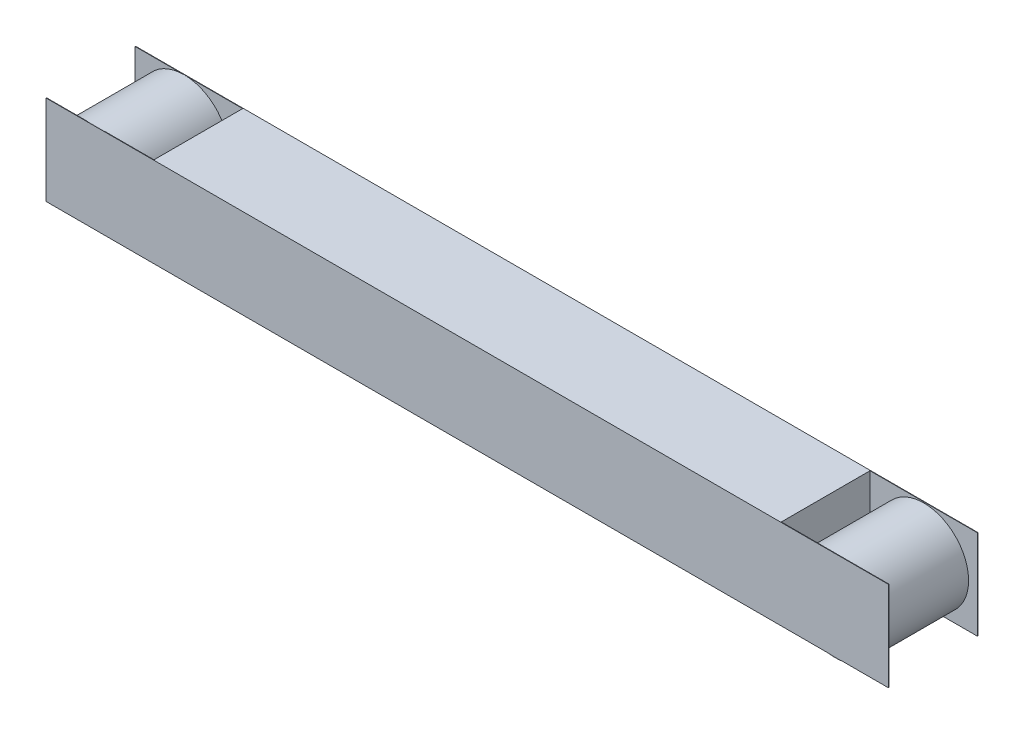
ISO-10303-21;
HEADER;
FILE_DESCRIPTION(('STEP AP214'),'2;1');
FILE_NAME('part.step','',(''),(''),'','','');
FILE_SCHEMA(('AUTOMOTIVE_DESIGN { 1 0 10303 214 1 1 1 1 }'));
ENDSEC;
DATA;
#1=APPLICATION_CONTEXT('core data for automotive mechanical design processes');
#2=APPLICATION_PROTOCOL_DEFINITION('international standard','automotive_design',2000,#1);
#3=PRODUCT_CONTEXT('',#1,'mechanical');
#4=PRODUCT('Part','Part','',(#3));
#5=PRODUCT_RELATED_PRODUCT_CATEGORY('part','',(#4));
#6=PRODUCT_DEFINITION_FORMATION('','',#4);
#7=PRODUCT_DEFINITION_CONTEXT('part definition',#1,'design');
#8=PRODUCT_DEFINITION('design','',#6,#7);
#9=PRODUCT_DEFINITION_SHAPE('','',#8);
#10=(LENGTH_UNIT() NAMED_UNIT(*) SI_UNIT(.MILLI.,.METRE.));
#11=(NAMED_UNIT(*) PLANE_ANGLE_UNIT() SI_UNIT($,.RADIAN.));
#12=(NAMED_UNIT(*) SI_UNIT($,.STERADIAN.) SOLID_ANGLE_UNIT());
#13=UNCERTAINTY_MEASURE_WITH_UNIT(LENGTH_MEASURE(1.E-05),#10,'distance_accuracy_value','');
#14=(GEOMETRIC_REPRESENTATION_CONTEXT(3) GLOBAL_UNCERTAINTY_ASSIGNED_CONTEXT((#13)) GLOBAL_UNIT_ASSIGNED_CONTEXT((#10,
#11,#12)) REPRESENTATION_CONTEXT('',''));
#15=CARTESIAN_POINT('',(0.,0.,0.));
#16=DIRECTION('',(0.,0.,1.));
#17=DIRECTION('',(1.,0.,0.));
#18=AXIS2_PLACEMENT_3D('',#15,#16,#17);
#19=CARTESIAN_POINT('',(0.,0.,0.0250000000000007));
#20=DIRECTION('',(0.,0.,1.));
#21=DIRECTION('',(1.,0.,0.));
#22=AXIS2_PLACEMENT_3D('',#19,#20,#21);
#23=PLANE('',#22);
#24=DIRECTION('',(1.,0.,0.));
#25=VECTOR('',#24,1.);
#26=CARTESIAN_POINT('',(47.,-4.99999999999999,0.0250000000000007));
#27=LINE('',#26,#25);
#28=CARTESIAN_POINT('',(0.,-5.,0.0250000000000007));
#29=VERTEX_POINT('',#28);
#30=CARTESIAN_POINT('',(2.73169255951889,-5.,0.0250000000000007));
#31=VERTEX_POINT('',#30);
#32=EDGE_CURVE('E263',#29,#31,#27,.T.);
#33=ORIENTED_EDGE('',*,*,#32,.T.);
#34=CARTESIAN_POINT('',(2.73169255951889,-2.5,0.0250000000000007));
#35=DIRECTION('',(0.,0.,1.));
#36=DIRECTION('',(1.,0.,0.));
#37=AXIS2_PLACEMENT_3D('',#34,#35,#36);
#38=CIRCLE('',#37,2.5);
#39=CARTESIAN_POINT('',(2.73169255951889,0.,0.0250000000000007));
#40=VERTEX_POINT('',#39);
#41=EDGE_CURVE('E55',#40,#31,#38,.T.);
#42=ORIENTED_EDGE('',*,*,#41,.F.);
#43=DIRECTION('',(-1.,0.,0.));
#44=VECTOR('',#43,1.);
#45=CARTESIAN_POINT('',(6.,0.,0.0250000000000007));
#46=LINE('',#45,#44);
#47=CARTESIAN_POINT('',(0.,0.,0.0250000000000007));
#48=VERTEX_POINT('',#47);
#49=EDGE_CURVE('E224',#40,#48,#46,.T.);
#50=ORIENTED_EDGE('',*,*,#49,.T.);
#51=DIRECTION('',(0.,-1.,0.));
#52=VECTOR('',#51,1.);
#53=CARTESIAN_POINT('',(0.,0.,0.0250000000000007));
#54=LINE('',#53,#52);
#55=EDGE_CURVE('E223',#48,#29,#54,.T.);
#56=ORIENTED_EDGE('',*,*,#55,.T.);
#57=EDGE_LOOP('',(#33,#42,#50,#56));
#58=FACE_BOUND('',#57,.T.);
#59=ADVANCED_FACE('F41',(#58),#23,.T.);
#60=CARTESIAN_POINT('',(0.,0.,4.975));
#61=DIRECTION('',(0.,0.,1.));
#62=DIRECTION('',(1.,0.,0.));
#63=AXIS2_PLACEMENT_3D('',#60,#61,#62);
#64=PLANE('',#63);
#65=CARTESIAN_POINT('',(2.73169255951889,-2.5,4.975));
#66=DIRECTION('',(0.,0.,1.));
#67=DIRECTION('',(1.,0.,0.));
#68=AXIS2_PLACEMENT_3D('',#65,#66,#67);
#69=CIRCLE('',#68,2.5);
#70=CARTESIAN_POINT('',(2.73169255951889,0.,4.975));
#71=VERTEX_POINT('',#70);
#72=CARTESIAN_POINT('',(2.73169255951889,-5.,4.975));
#73=VERTEX_POINT('',#72);
#74=EDGE_CURVE('E172',#71,#73,#69,.T.);
#75=ORIENTED_EDGE('',*,*,#74,.T.);
#76=DIRECTION('',(1.,0.,0.));
#77=VECTOR('',#76,1.);
#78=CARTESIAN_POINT('',(47.,-4.99999999999999,4.975));
#79=LINE('',#78,#77);
#80=CARTESIAN_POINT('',(0.,-5.,4.975));
#81=VERTEX_POINT('',#80);
#82=EDGE_CURVE('E153',#81,#73,#79,.T.);
#83=ORIENTED_EDGE('',*,*,#82,.F.);
#84=DIRECTION('',(0.,-1.,0.));
#85=VECTOR('',#84,1.);
#86=CARTESIAN_POINT('',(0.,0.,4.975));
#87=LINE('',#86,#85);
#88=CARTESIAN_POINT('',(0.,0.,4.975));
#89=VERTEX_POINT('',#88);
#90=EDGE_CURVE('E235',#89,#81,#87,.T.);
#91=ORIENTED_EDGE('',*,*,#90,.F.);
#92=DIRECTION('',(-1.,0.,0.));
#93=VECTOR('',#92,1.);
#94=CARTESIAN_POINT('',(6.,0.,4.975));
#95=LINE('',#94,#93);
#96=EDGE_CURVE('E174',#71,#89,#95,.T.);
#97=ORIENTED_EDGE('',*,*,#96,.F.);
#98=EDGE_LOOP('',(#75,#83,#91,#97));
#99=FACE_BOUND('',#98,.T.);
#100=ADVANCED_FACE('F173',(#99),#64,.F.);
#101=CARTESIAN_POINT('',(0.,-5.,5.));
#102=DIRECTION('',(1.,0.,0.));
#103=DIRECTION('',(0.,0.,-1.));
#104=AXIS2_PLACEMENT_3D('',#101,#102,#103);
#105=PLANE('',#104);
#106=ORIENTED_EDGE('',*,*,#55,.F.);
#107=DIRECTION('',(0.,0.,-1.));
#108=VECTOR('',#107,1.);
#109=CARTESIAN_POINT('',(0.,0.,5.));
#110=LINE('',#109,#108);
#111=CARTESIAN_POINT('',(0.,0.,0.));
#112=VERTEX_POINT('',#111);
#113=EDGE_CURVE('E278',#48,#112,#110,.T.);
#114=ORIENTED_EDGE('',*,*,#113,.T.);
#115=DIRECTION('',(0.,-1.,0.));
#116=VECTOR('',#115,1.);
#117=CARTESIAN_POINT('',(0.,-5.,0.));
#118=LINE('',#117,#116);
#119=CARTESIAN_POINT('',(0.,-5.,0.));
#120=VERTEX_POINT('',#119);
#121=EDGE_CURVE('E267',#112,#120,#118,.T.);
#122=ORIENTED_EDGE('',*,*,#121,.T.);
#123=DIRECTION('',(0.,0.,-1.));
#124=VECTOR('',#123,1.);
#125=CARTESIAN_POINT('',(0.,-5.,5.));
#126=LINE('',#125,#124);
#127=EDGE_CURVE('E300',#29,#120,#126,.T.);
#128=ORIENTED_EDGE('',*,*,#127,.F.);
#129=EDGE_LOOP('',(#106,#114,#122,#128));
#130=FACE_BOUND('',#129,.T.);
#131=ADVANCED_FACE('F198',(#130),#105,.F.);
#132=CARTESIAN_POINT('',(47.,-4.99999999999999,5.));
#133=DIRECTION('',(0.,1.,0.));
#134=DIRECTION('',(-1.,0.,0.));
#135=AXIS2_PLACEMENT_3D('',#132,#133,#134);
#136=PLANE('',#135);
#137=ORIENTED_EDGE('',*,*,#32,.F.);
#138=ORIENTED_EDGE('',*,*,#127,.T.);
#139=DIRECTION('',(1.,0.,0.));
#140=VECTOR('',#139,1.);
#141=CARTESIAN_POINT('',(47.,-4.99999999999999,0.));
#142=LINE('',#141,#140);
#143=CARTESIAN_POINT('',(47.,-4.99999999999999,0.));
#144=VERTEX_POINT('',#143);
#145=EDGE_CURVE('E281',#120,#144,#142,.T.);
#146=ORIENTED_EDGE('',*,*,#145,.T.);
#147=DIRECTION('',(0.,0.,-1.));
#148=VECTOR('',#147,1.);
#149=CARTESIAN_POINT('',(47.,-4.99999999999999,5.));
#150=LINE('',#149,#148);
#151=CARTESIAN_POINT('',(47.,-4.99999999999999,0.0250000000000007));
#152=VERTEX_POINT('',#151);
#153=EDGE_CURVE('E296',#152,#144,#150,.T.);
#154=ORIENTED_EDGE('',*,*,#153,.F.);
#155=DIRECTION('',(-1.,0.,0.));
#156=VECTOR('',#155,1.);
#157=CARTESIAN_POINT('',(47.,-4.99999999999999,0.0250000000000007));
#158=LINE('',#157,#156);
#159=CARTESIAN_POINT('',(44.5238256887148,-4.99999999999999,0.0250000000000007));
#160=VERTEX_POINT('',#159);
#161=EDGE_CURVE('E257',#152,#160,#158,.T.);
#162=ORIENTED_EDGE('',*,*,#161,.T.);
#163=CARTESIAN_POINT('',(43.4761743112852,-5.,0.0250000000000007));
#164=VERTEX_POINT('',#163);
#165=EDGE_CURVE('E260',#160,#164,#158,.T.);
#166=ORIENTED_EDGE('',*,*,#165,.T.);
#167=CARTESIAN_POINT('',(41.,-4.99999999999999,0.0250000000000007));
#168=VERTEX_POINT('',#167);
#169=EDGE_CURVE('E255',#164,#168,#158,.T.);
#170=ORIENTED_EDGE('',*,*,#169,.T.);
#171=DIRECTION('',(0.,0.,1.));
#172=VECTOR('',#171,1.);
#173=CARTESIAN_POINT('',(41.,-4.99999999999999,5.));
#174=LINE('',#173,#172);
#175=CARTESIAN_POINT('',(41.,-4.99999999999999,4.975));
#176=VERTEX_POINT('',#175);
#177=EDGE_CURVE('E170',#168,#176,#174,.T.);
#178=ORIENTED_EDGE('',*,*,#177,.T.);
#179=DIRECTION('',(-1.,0.,0.));
#180=VECTOR('',#179,1.);
#181=CARTESIAN_POINT('',(47.,-4.99999999999999,4.975));
#182=LINE('',#181,#180);
#183=CARTESIAN_POINT('',(43.4761743112852,-4.99999999999999,4.975));
#184=VERTEX_POINT('',#183);
#185=EDGE_CURVE('E239',#184,#176,#182,.T.);
#186=ORIENTED_EDGE('',*,*,#185,.F.);
#187=CARTESIAN_POINT('',(44.5238256887148,-5.,4.975));
#188=VERTEX_POINT('',#187);
#189=EDGE_CURVE('E256',#188,#184,#182,.T.);
#190=ORIENTED_EDGE('',*,*,#189,.F.);
#191=CARTESIAN_POINT('',(47.,-4.99999999999999,4.975));
#192=VERTEX_POINT('',#191);
#193=EDGE_CURVE('E252',#192,#188,#182,.T.);
#194=ORIENTED_EDGE('',*,*,#193,.F.);
#195=CARTESIAN_POINT('',(47.,-4.99999999999999,5.));
#196=VERTEX_POINT('',#195);
#197=EDGE_CURVE('E297',#196,#192,#150,.T.);
#198=ORIENTED_EDGE('',*,*,#197,.F.);
#199=DIRECTION('',(1.,0.,0.));
#200=VECTOR('',#199,1.);
#201=CARTESIAN_POINT('',(47.,-4.99999999999999,5.));
#202=LINE('',#201,#200);
#203=CARTESIAN_POINT('',(0.,-5.,5.));
#204=VERTEX_POINT('',#203);
#205=EDGE_CURVE('E271',#204,#196,#202,.T.);
#206=ORIENTED_EDGE('',*,*,#205,.F.);
#207=EDGE_CURVE('E160',#204,#81,#126,.T.);
#208=ORIENTED_EDGE('',*,*,#207,.T.);
#209=ORIENTED_EDGE('',*,*,#82,.T.);
#210=CARTESIAN_POINT('',(6.,-5.,4.975));
#211=VERTEX_POINT('',#210);
#212=EDGE_CURVE('E157',#73,#211,#79,.T.);
#213=ORIENTED_EDGE('',*,*,#212,.T.);
#214=DIRECTION('',(0.,0.,-1.));
#215=VECTOR('',#214,1.);
#216=CARTESIAN_POINT('',(6.,-5.,5.));
#217=LINE('',#216,#215);
#218=CARTESIAN_POINT('',(6.,-5.,0.0250000000000007));
#219=VERTEX_POINT('',#218);
#220=EDGE_CURVE('E265',#211,#219,#217,.T.);
#221=ORIENTED_EDGE('',*,*,#220,.T.);
#222=EDGE_CURVE('E165',#31,#219,#27,.T.);
#223=ORIENTED_EDGE('',*,*,#222,.F.);
#224=EDGE_LOOP('',(#137,#138,#146,#154,#162,#166,#170,#178,#186,#190,#194,#198,#206,#208,#209,
#213,#221,#223));
#225=FACE_BOUND('',#224,.T.);
#226=ADVANCED_FACE('F155',(#225),#136,.F.);
#227=CARTESIAN_POINT('',(47.,0.,5.));
#228=DIRECTION('',(-1.,0.,0.));
#229=DIRECTION('',(0.,0.,1.));
#230=AXIS2_PLACEMENT_3D('',#227,#228,#229);
#231=PLANE('',#230);
#232=DIRECTION('',(0.,1.,0.));
#233=VECTOR('',#232,1.);
#234=CARTESIAN_POINT('',(47.,0.144283051341144,4.975));
#235=LINE('',#234,#233);
#236=CARTESIAN_POINT('',(47.,0.,4.975));
#237=VERTEX_POINT('',#236);
#238=EDGE_CURVE('E240',#192,#237,#235,.T.);
#239=ORIENTED_EDGE('',*,*,#238,.T.);
#240=DIRECTION('',(0.,0.,-1.));
#241=VECTOR('',#240,1.);
#242=CARTESIAN_POINT('',(47.,0.,5.));
#243=LINE('',#242,#241);
#244=CARTESIAN_POINT('',(47.,0.,5.));
#245=VERTEX_POINT('',#244);
#246=EDGE_CURVE('E293',#245,#237,#243,.T.);
#247=ORIENTED_EDGE('',*,*,#246,.F.);
#248=DIRECTION('',(0.,1.,0.));
#249=VECTOR('',#248,1.);
#250=CARTESIAN_POINT('',(47.,0.,5.));
#251=LINE('',#250,#249);
#252=EDGE_CURVE('E274',#196,#245,#251,.T.);
#253=ORIENTED_EDGE('',*,*,#252,.F.);
#254=ORIENTED_EDGE('',*,*,#197,.T.);
#255=EDGE_LOOP('',(#239,#247,#253,#254));
#256=FACE_BOUND('',#255,.T.);
#257=ADVANCED_FACE('F339',(#256),#231,.F.);
#258=CARTESIAN_POINT('',(0.,0.,5.));
#259=DIRECTION('',(0.,-1.,0.));
#260=DIRECTION('',(0.,0.,-1.));
#261=AXIS2_PLACEMENT_3D('',#258,#259,#260);
#262=PLANE('',#261);
#263=CARTESIAN_POINT('',(6.,0.,0.0250000000000007));
#264=VERTEX_POINT('',#263);
#265=EDGE_CURVE('E214',#264,#40,#46,.T.);
#266=ORIENTED_EDGE('',*,*,#265,.F.);
#267=DIRECTION('',(0.,0.,1.));
#268=VECTOR('',#267,1.);
#269=CARTESIAN_POINT('',(6.,0.,0.0250000000000007));
#270=LINE('',#269,#268);
#271=CARTESIAN_POINT('',(6.,0.,4.975));
#272=VERTEX_POINT('',#271);
#273=EDGE_CURVE('E232',#264,#272,#270,.T.);
#274=ORIENTED_EDGE('',*,*,#273,.T.);
#275=EDGE_CURVE('E233',#272,#71,#95,.T.);
#276=ORIENTED_EDGE('',*,*,#275,.T.);
#277=ORIENTED_EDGE('',*,*,#96,.T.);
#278=CARTESIAN_POINT('',(0.,0.,5.));
#279=VERTEX_POINT('',#278);
#280=EDGE_CURVE('E289',#279,#89,#110,.T.);
#281=ORIENTED_EDGE('',*,*,#280,.F.);
#282=DIRECTION('',(-1.,0.,0.));
#283=VECTOR('',#282,1.);
#284=CARTESIAN_POINT('',(0.,0.,5.));
#285=LINE('',#284,#283);
#286=EDGE_CURVE('E276',#245,#279,#285,.T.);
#287=ORIENTED_EDGE('',*,*,#286,.F.);
#288=ORIENTED_EDGE('',*,*,#246,.T.);
#289=DIRECTION('',(1.,0.,0.));
#290=VECTOR('',#289,1.);
#291=CARTESIAN_POINT('',(0.,0.,4.975));
#292=LINE('',#291,#290);
#293=CARTESIAN_POINT('',(41.,0.,4.975));
#294=VERTEX_POINT('',#293);
#295=EDGE_CURVE('E302',#294,#237,#292,.T.);
#296=ORIENTED_EDGE('',*,*,#295,.F.);
#297=DIRECTION('',(0.,0.,-1.));
#298=VECTOR('',#297,1.);
#299=CARTESIAN_POINT('',(41.,0.,5.));
#300=LINE('',#299,#298);
#301=CARTESIAN_POINT('',(41.,0.,0.0250000000000007));
#302=VERTEX_POINT('',#301);
#303=EDGE_CURVE('E304',#294,#302,#300,.T.);
#304=ORIENTED_EDGE('',*,*,#303,.T.);
#305=DIRECTION('',(1.,0.,0.));
#306=VECTOR('',#305,1.);
#307=CARTESIAN_POINT('',(0.,0.,0.0250000000000007));
#308=LINE('',#307,#306);
#309=CARTESIAN_POINT('',(47.,0.,0.0250000000000007));
#310=VERTEX_POINT('',#309);
#311=EDGE_CURVE('E307',#302,#310,#308,.T.);
#312=ORIENTED_EDGE('',*,*,#311,.T.);
#313=CARTESIAN_POINT('',(47.,0.,0.));
#314=VERTEX_POINT('',#313);
#315=EDGE_CURVE('E292',#310,#314,#243,.T.);
#316=ORIENTED_EDGE('',*,*,#315,.T.);
#317=DIRECTION('',(-1.,0.,0.));
#318=VECTOR('',#317,1.);
#319=CARTESIAN_POINT('',(0.,0.,0.));
#320=LINE('',#319,#318);
#321=EDGE_CURVE('E272',#314,#112,#320,.T.);
#322=ORIENTED_EDGE('',*,*,#321,.T.);
#323=ORIENTED_EDGE('',*,*,#113,.F.);
#324=ORIENTED_EDGE('',*,*,#49,.F.);
#325=EDGE_LOOP('',(#266,#274,#276,#277,#281,#287,#288,#296,#304,#312,#316,#322,#323,#324));
#326=FACE_BOUND('',#325,.T.);
#327=ADVANCED_FACE('F322',(#326),#262,.F.);
#328=ORIENTED_EDGE('',*,*,#280,.T.);
#329=ORIENTED_EDGE('',*,*,#90,.T.);
#330=ORIENTED_EDGE('',*,*,#207,.F.);
#331=DIRECTION('',(0.,-1.,0.));
#332=VECTOR('',#331,1.);
#333=CARTESIAN_POINT('',(0.,-5.,5.));
#334=LINE('',#333,#332);
#335=EDGE_CURVE('E268',#279,#204,#334,.T.);
#336=ORIENTED_EDGE('',*,*,#335,.F.);
#337=EDGE_LOOP('',(#328,#329,#330,#336));
#338=FACE_BOUND('',#337,.T.);
#339=ADVANCED_FACE('F43',(#338),#105,.F.);
#340=ORIENTED_EDGE('',*,*,#315,.F.);
#341=DIRECTION('',(0.,1.,0.));
#342=VECTOR('',#341,1.);
#343=CARTESIAN_POINT('',(47.,0.144283051341144,0.0250000000000007));
#344=LINE('',#343,#342);
#345=EDGE_CURVE('E247',#152,#310,#344,.T.);
#346=ORIENTED_EDGE('',*,*,#345,.F.);
#347=ORIENTED_EDGE('',*,*,#153,.T.);
#348=DIRECTION('',(0.,1.,0.));
#349=VECTOR('',#348,1.);
#350=CARTESIAN_POINT('',(47.,0.,0.));
#351=LINE('',#350,#349);
#352=EDGE_CURVE('E284',#144,#314,#351,.T.);
#353=ORIENTED_EDGE('',*,*,#352,.T.);
#354=EDGE_LOOP('',(#340,#346,#347,#353));
#355=FACE_BOUND('',#354,.T.);
#356=ADVANCED_FACE('F348',(#355),#231,.F.);
#357=CARTESIAN_POINT('',(0.,0.,5.));
#358=DIRECTION('',(0.,0.,-1.));
#359=DIRECTION('',(-1.,0.,0.));
#360=AXIS2_PLACEMENT_3D('',#357,#358,#359);
#361=PLANE('',#360);
#362=ORIENTED_EDGE('',*,*,#335,.T.);
#363=ORIENTED_EDGE('',*,*,#205,.T.);
#364=ORIENTED_EDGE('',*,*,#252,.T.);
#365=ORIENTED_EDGE('',*,*,#286,.T.);
#366=EDGE_LOOP('',(#362,#363,#364,#365));
#367=FACE_BOUND('',#366,.T.);
#368=ADVANCED_FACE('F333',(#367),#361,.F.);
#369=CARTESIAN_POINT('',(0.,0.,0.));
#370=DIRECTION('',(0.,0.,-1.));
#371=DIRECTION('',(-1.,0.,0.));
#372=AXIS2_PLACEMENT_3D('',#369,#370,#371);
#373=PLANE('',#372);
#374=ORIENTED_EDGE('',*,*,#121,.F.);
#375=ORIENTED_EDGE('',*,*,#321,.F.);
#376=ORIENTED_EDGE('',*,*,#352,.F.);
#377=ORIENTED_EDGE('',*,*,#145,.F.);
#378=EDGE_LOOP('',(#374,#375,#376,#377));
#379=FACE_BOUND('',#378,.T.);
#380=ADVANCED_FACE('F352',(#379),#373,.T.);
#381=CARTESIAN_POINT('',(41.,-5.26410969071326,0.0250000000000007));
#382=DIRECTION('',(-1.,0.,0.));
#383=DIRECTION('',(0.,0.,1.));
#384=AXIS2_PLACEMENT_3D('',#381,#382,#383);
#385=PLANE('',#384);
#386=DIRECTION('',(0.,-1.,0.));
#387=VECTOR('',#386,1.);
#388=CARTESIAN_POINT('',(41.,-5.26410969071326,0.0250000000000007));
#389=LINE('',#388,#387);
#390=EDGE_CURVE('E244',#302,#168,#389,.T.);
#391=ORIENTED_EDGE('',*,*,#390,.F.);
#392=ORIENTED_EDGE('',*,*,#303,.F.);
#393=DIRECTION('',(0.,-1.,0.));
#394=VECTOR('',#393,1.);
#395=CARTESIAN_POINT('',(41.,-5.26410969071326,4.975));
#396=LINE('',#395,#394);
#397=EDGE_CURVE('E243',#294,#176,#396,.T.);
#398=ORIENTED_EDGE('',*,*,#397,.T.);
#399=ORIENTED_EDGE('',*,*,#177,.F.);
#400=EDGE_LOOP('',(#391,#392,#398,#399));
#401=FACE_BOUND('',#400,.T.);
#402=ADVANCED_FACE('F343',(#401),#385,.F.);
#403=CARTESIAN_POINT('',(0.,0.,0.0250000000000007));
#404=DIRECTION('',(0.,0.,-1.));
#405=DIRECTION('',(-1.,0.,0.));
#406=AXIS2_PLACEMENT_3D('',#403,#404,#405);
#407=PLANE('',#406);
#408=CARTESIAN_POINT('',(44.,-2.55549460056996,0.0250000000000007));
#409=DIRECTION('',(0.,0.,1.));
#410=DIRECTION('',(1.,0.,0.));
#411=AXIS2_PLACEMENT_3D('',#408,#409,#410);
#412=CIRCLE('',#411,2.50000000000002);
#413=EDGE_CURVE('E177',#160,#164,#412,.T.);
#414=ORIENTED_EDGE('',*,*,#413,.F.);
#415=ORIENTED_EDGE('',*,*,#161,.F.);
#416=ORIENTED_EDGE('',*,*,#345,.T.);
#417=ORIENTED_EDGE('',*,*,#311,.F.);
#418=ORIENTED_EDGE('',*,*,#390,.T.);
#419=ORIENTED_EDGE('',*,*,#169,.F.);
#420=EDGE_LOOP('',(#414,#415,#416,#417,#418,#419));
#421=FACE_BOUND('',#420,.T.);
#422=ADVANCED_FACE('F359',(#421),#407,.F.);
#423=CARTESIAN_POINT('',(0.,0.,4.975));
#424=DIRECTION('',(0.,0.,-1.));
#425=DIRECTION('',(-1.,0.,0.));
#426=AXIS2_PLACEMENT_3D('',#423,#424,#425);
#427=PLANE('',#426);
#428=ORIENTED_EDGE('',*,*,#193,.T.);
#429=CARTESIAN_POINT('',(44.,-2.55549460056996,4.975));
#430=DIRECTION('',(0.,0.,-1.));
#431=DIRECTION('',(-1.,0.,0.));
#432=AXIS2_PLACEMENT_3D('',#429,#430,#431);
#433=CIRCLE('',#432,2.50000000000002);
#434=EDGE_CURVE('E49',#188,#184,#433,.F.);
#435=ORIENTED_EDGE('',*,*,#434,.T.);
#436=ORIENTED_EDGE('',*,*,#185,.T.);
#437=ORIENTED_EDGE('',*,*,#397,.F.);
#438=ORIENTED_EDGE('',*,*,#295,.T.);
#439=ORIENTED_EDGE('',*,*,#238,.F.);
#440=EDGE_LOOP('',(#428,#435,#436,#437,#438,#439));
#441=FACE_BOUND('',#440,.T.);
#442=ADVANCED_FACE('F209',(#441),#427,.T.);
#443=CARTESIAN_POINT('',(6.,-5.26410969071323,0.0250000000000007));
#444=DIRECTION('',(1.,0.,0.));
#445=DIRECTION('',(0.,0.,-1.));
#446=AXIS2_PLACEMENT_3D('',#443,#444,#445);
#447=PLANE('',#446);
#448=DIRECTION('',(0.,1.,0.));
#449=VECTOR('',#448,1.);
#450=CARTESIAN_POINT('',(6.,-5.26410969071323,4.975));
#451=LINE('',#450,#449);
#452=EDGE_CURVE('E169',#211,#272,#451,.T.);
#453=ORIENTED_EDGE('',*,*,#452,.T.);
#454=ORIENTED_EDGE('',*,*,#273,.F.);
#455=DIRECTION('',(0.,1.,0.));
#456=VECTOR('',#455,1.);
#457=CARTESIAN_POINT('',(6.,-5.26410969071323,0.0250000000000007));
#458=LINE('',#457,#456);
#459=EDGE_CURVE('E218',#219,#264,#458,.T.);
#460=ORIENTED_EDGE('',*,*,#459,.F.);
#461=ORIENTED_EDGE('',*,*,#220,.F.);
#462=EDGE_LOOP('',(#453,#454,#460,#461));
#463=FACE_BOUND('',#462,.T.);
#464=ADVANCED_FACE('F202',(#463),#447,.F.);
#465=ORIENTED_EDGE('',*,*,#265,.T.);
#466=EDGE_CURVE('E215',#31,#40,#38,.T.);
#467=ORIENTED_EDGE('',*,*,#466,.F.);
#468=ORIENTED_EDGE('',*,*,#222,.T.);
#469=ORIENTED_EDGE('',*,*,#459,.T.);
#470=EDGE_LOOP('',(#465,#467,#468,#469));
#471=FACE_BOUND('',#470,.T.);
#472=ADVANCED_FACE('F194',(#471),#23,.T.);
#473=CARTESIAN_POINT('',(2.73169255951889,-2.5,4.975));
#474=DIRECTION('',(0.,0.,1.));
#475=DIRECTION('',(1.,0.,0.));
#476=AXIS2_PLACEMENT_3D('',#473,#474,#475);
#477=CIRCLE('',#476,2.5);
#478=EDGE_CURVE('E11',#71,#73,#477,.F.);
#479=ORIENTED_EDGE('',*,*,#478,.F.);
#480=ORIENTED_EDGE('',*,*,#275,.F.);
#481=ORIENTED_EDGE('',*,*,#452,.F.);
#482=ORIENTED_EDGE('',*,*,#212,.F.);
#483=EDGE_LOOP('',(#479,#480,#481,#482));
#484=FACE_BOUND('',#483,.T.);
#485=ADVANCED_FACE('F168',(#484),#64,.F.);
#486=CARTESIAN_POINT('',(44.,-2.55549460056996,4.975));
#487=DIRECTION('',(0.,0.,1.));
#488=DIRECTION('',(1.,0.,0.));
#489=AXIS2_PLACEMENT_3D('',#486,#487,#488);
#490=PLANE('',#489);
#491=ORIENTED_EDGE('',*,*,#189,.T.);
#492=CARTESIAN_POINT('',(44.,-2.55549460056996,4.975));
#493=DIRECTION('',(0.,0.,1.));
#494=DIRECTION('',(1.,0.,0.));
#495=AXIS2_PLACEMENT_3D('',#492,#493,#494);
#496=CIRCLE('',#495,2.50000000000002);
#497=EDGE_CURVE('E249',#184,#188,#496,.T.);
#498=ORIENTED_EDGE('',*,*,#497,.T.);
#499=EDGE_LOOP('',(#491,#498));
#500=FACE_BOUND('',#499,.T.);
#501=ADVANCED_FACE('F207',(#500),#490,.T.);
#502=CARTESIAN_POINT('',(44.,-2.55549460056996,0.0250000000000007));
#503=DIRECTION('',(0.,0.,1.));
#504=DIRECTION('',(1.,0.,0.));
#505=AXIS2_PLACEMENT_3D('',#502,#503,#504);
#506=PLANE('',#505);
#507=EDGE_CURVE('E228',#164,#160,#412,.T.);
#508=ORIENTED_EDGE('',*,*,#507,.F.);
#509=ORIENTED_EDGE('',*,*,#165,.F.);
#510=EDGE_LOOP('',(#508,#509));
#511=FACE_BOUND('',#510,.T.);
#512=ADVANCED_FACE('F187',(#511),#506,.F.);
#513=CARTESIAN_POINT('',(44.,-2.55549460056996,4.975));
#514=DIRECTION('',(0.,0.,-1.));
#515=DIRECTION('',(-1.,0.,0.));
#516=AXIS2_PLACEMENT_3D('',#513,#514,#515);
#517=CYLINDRICAL_SURFACE('',#516,2.50000000000002);
#518=ORIENTED_EDGE('',*,*,#497,.F.);
#519=ORIENTED_EDGE('',*,*,#434,.F.);
#520=EDGE_LOOP('',(#518,#519));
#521=FACE_BOUND('',#520,.T.);
#522=ORIENTED_EDGE('',*,*,#507,.T.);
#523=ORIENTED_EDGE('',*,*,#413,.T.);
#524=EDGE_LOOP('',(#522,#523));
#525=FACE_BOUND('',#524,.T.);
#526=ADVANCED_FACE('F181',(#521,#525),#517,.T.);
#527=CARTESIAN_POINT('',(2.73169255951889,-2.5,4.975));
#528=DIRECTION('',(0.,0.,-1.));
#529=DIRECTION('',(-1.,0.,0.));
#530=AXIS2_PLACEMENT_3D('',#527,#528,#529);
#531=CYLINDRICAL_SURFACE('',#530,2.5);
#532=ORIENTED_EDGE('',*,*,#74,.F.);
#533=ORIENTED_EDGE('',*,*,#478,.T.);
#534=EDGE_LOOP('',(#532,#533));
#535=FACE_BOUND('',#534,.T.);
#536=ORIENTED_EDGE('',*,*,#41,.T.);
#537=ORIENTED_EDGE('',*,*,#466,.T.);
#538=EDGE_LOOP('',(#536,#537));
#539=FACE_BOUND('',#538,.T.);
#540=ADVANCED_FACE('F179',(#535,#539),#531,.T.);
#541=CLOSED_SHELL('',(#59,#100,#131,#226,#257,#327,#339,#356,#368,#380,#402,#422,#442,#464,#472,
#485,#501,#512,#526,#540));
#542=MANIFOLD_SOLID_BREP('B2',#541);
#543=ADVANCED_BREP_SHAPE_REPRESENTATION('',(#18,#542),#14);
#544=SHAPE_DEFINITION_REPRESENTATION(#9,#543);
ENDSEC;
END-ISO-10303-21;
